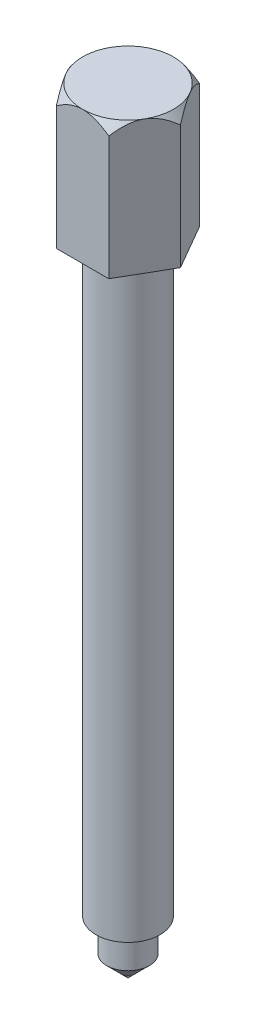
ISO-10303-21;
HEADER;
FILE_DESCRIPTION(('STEP AP214'),'2;1');
FILE_NAME('part.step','',(''),(''),'','','');
FILE_SCHEMA(('AUTOMOTIVE_DESIGN { 1 0 10303 214 1 1 1 1 }'));
ENDSEC;
DATA;
#1=APPLICATION_CONTEXT('core data for automotive mechanical design processes');
#2=APPLICATION_PROTOCOL_DEFINITION('international standard','automotive_design',2000,#1);
#3=PRODUCT_CONTEXT('',#1,'mechanical');
#4=PRODUCT('Part','Part','',(#3));
#5=PRODUCT_RELATED_PRODUCT_CATEGORY('part','',(#4));
#6=PRODUCT_DEFINITION_FORMATION('','',#4);
#7=PRODUCT_DEFINITION_CONTEXT('part definition',#1,'design');
#8=PRODUCT_DEFINITION('design','',#6,#7);
#9=PRODUCT_DEFINITION_SHAPE('','',#8);
#10=(LENGTH_UNIT() NAMED_UNIT(*) SI_UNIT(.MILLI.,.METRE.));
#11=(NAMED_UNIT(*) PLANE_ANGLE_UNIT() SI_UNIT($,.RADIAN.));
#12=(NAMED_UNIT(*) SI_UNIT($,.STERADIAN.) SOLID_ANGLE_UNIT());
#13=UNCERTAINTY_MEASURE_WITH_UNIT(LENGTH_MEASURE(1.E-05),#10,'distance_accuracy_value','');
#14=(GEOMETRIC_REPRESENTATION_CONTEXT(3) GLOBAL_UNCERTAINTY_ASSIGNED_CONTEXT((#13)) GLOBAL_UNIT_ASSIGNED_CONTEXT((#10,
#11,#12)) REPRESENTATION_CONTEXT('',''));
#15=CARTESIAN_POINT('',(0.,0.,0.));
#16=DIRECTION('',(0.,0.,1.));
#17=DIRECTION('',(1.,0.,0.));
#18=AXIS2_PLACEMENT_3D('',#15,#16,#17);
#19=CARTESIAN_POINT('',(0.,-135.,0.));
#20=DIRECTION('',(0.,-1.,0.));
#21=DIRECTION('',(0.,0.,-1.));
#22=AXIS2_PLACEMENT_3D('',#19,#20,#21);
#23=PLANE('',#22);
#24=CARTESIAN_POINT('',(0.,-135.,0.));
#25=DIRECTION('',(0.,-1.,0.));
#26=DIRECTION('',(0.,0.,-1.));
#27=AXIS2_PLACEMENT_3D('',#24,#25,#26);
#28=CIRCLE('',#27,6.);
#29=CARTESIAN_POINT('',(0.,-135.,-6.));
#30=VERTEX_POINT('',#29);
#31=EDGE_CURVE('E116',#30,#30,#28,.T.);
#32=ORIENTED_EDGE('',*,*,#31,.T.);
#33=EDGE_LOOP('',(#32));
#34=FACE_BOUND('',#33,.T.);
#35=CARTESIAN_POINT('',(0.,-135.,0.));
#36=DIRECTION('',(0.,-1.,0.));
#37=DIRECTION('',(0.,0.,-1.));
#38=AXIS2_PLACEMENT_3D('',#35,#36,#37);
#39=CIRCLE('',#38,4.);
#40=CARTESIAN_POINT('',(0.,-135.,-4.));
#41=VERTEX_POINT('',#40);
#42=EDGE_CURVE('E117',#41,#41,#39,.T.);
#43=ORIENTED_EDGE('',*,*,#42,.F.);
#44=EDGE_LOOP('',(#43));
#45=FACE_BOUND('',#44,.T.);
#46=ADVANCED_FACE('F33',(#34,#45),#23,.T.);
#47=CARTESIAN_POINT('',(0.,-25.,0.));
#48=DIRECTION('',(0.,1.,0.));
#49=DIRECTION('',(0.,0.,1.));
#50=AXIS2_PLACEMENT_3D('',#47,#48,#49);
#51=PLANE('',#50);
#52=DIRECTION('',(0.5,0.,-0.866025403784438));
#53=VECTOR('',#52,1.);
#54=CARTESIAN_POINT('',(4.90747728811183,-25.,8.49999999999999));
#55=LINE('',#54,#53);
#56=CARTESIAN_POINT('',(4.90747728811183,-25.,8.49999999999999));
#57=VERTEX_POINT('',#56);
#58=CARTESIAN_POINT('',(9.81495457622364,-25.,0.));
#59=VERTEX_POINT('',#58);
#60=EDGE_CURVE('E299',#57,#59,#55,.T.);
#61=ORIENTED_EDGE('',*,*,#60,.F.);
#62=DIRECTION('',(1.,0.,0.));
#63=VECTOR('',#62,1.);
#64=CARTESIAN_POINT('',(-4.90747728811181,-25.,8.49999999999999));
#65=LINE('',#64,#63);
#66=CARTESIAN_POINT('',(-4.90747728811181,-25.,8.49999999999999));
#67=VERTEX_POINT('',#66);
#68=EDGE_CURVE('E283',#67,#57,#65,.T.);
#69=ORIENTED_EDGE('',*,*,#68,.F.);
#70=DIRECTION('',(0.5,0.,0.866025403784438));
#71=VECTOR('',#70,1.);
#72=CARTESIAN_POINT('',(-9.81495457622364,-25.,0.));
#73=LINE('',#72,#71);
#74=CARTESIAN_POINT('',(-9.81495457622364,-25.,0.));
#75=VERTEX_POINT('',#74);
#76=EDGE_CURVE('E291',#75,#67,#73,.T.);
#77=ORIENTED_EDGE('',*,*,#76,.F.);
#78=DIRECTION('',(-0.5,0.,0.866025403784439));
#79=VECTOR('',#78,1.);
#80=CARTESIAN_POINT('',(-4.90747728811182,-25.,-8.5));
#81=LINE('',#80,#79);
#82=CARTESIAN_POINT('',(-4.90747728811182,-25.,-8.5));
#83=VERTEX_POINT('',#82);
#84=EDGE_CURVE('E293',#83,#75,#81,.T.);
#85=ORIENTED_EDGE('',*,*,#84,.F.);
#86=DIRECTION('',(-1.,0.,0.));
#87=VECTOR('',#86,1.);
#88=CARTESIAN_POINT('',(4.90747728811181,-25.,-8.5));
#89=LINE('',#88,#87);
#90=CARTESIAN_POINT('',(4.90747728811181,-25.,-8.5));
#91=VERTEX_POINT('',#90);
#92=EDGE_CURVE('E295',#91,#83,#89,.T.);
#93=ORIENTED_EDGE('',*,*,#92,.F.);
#94=DIRECTION('',(-0.5,0.,-0.866025403784439));
#95=VECTOR('',#94,1.);
#96=CARTESIAN_POINT('',(9.81495457622364,-25.,0.));
#97=LINE('',#96,#95);
#98=EDGE_CURVE('E298',#59,#91,#97,.T.);
#99=ORIENTED_EDGE('',*,*,#98,.F.);
#100=EDGE_LOOP('',(#61,#69,#77,#85,#93,#99));
#101=FACE_BOUND('',#100,.T.);
#102=CARTESIAN_POINT('',(0.,-25.,0.));
#103=DIRECTION('',(0.,1.,0.));
#104=DIRECTION('',(0.,0.,1.));
#105=AXIS2_PLACEMENT_3D('',#102,#103,#104);
#106=CIRCLE('',#105,6.);
#107=CARTESIAN_POINT('',(0.,-25.,6.));
#108=VERTEX_POINT('',#107);
#109=EDGE_CURVE('E12',#108,#108,#106,.F.);
#110=ORIENTED_EDGE('',*,*,#109,.F.);
#111=EDGE_LOOP('',(#110));
#112=FACE_BOUND('',#111,.T.);
#113=ADVANCED_FACE('F150',(#101,#112),#51,.F.);
#114=CARTESIAN_POINT('',(4.90747728811183,-25.,8.49999999999999));
#115=DIRECTION('',(0.866025403784438,0.,0.5));
#116=DIRECTION('',(0.5,0.,-0.866025403784439));
#117=AXIS2_PLACEMENT_3D('',#114,#115,#116);
#118=PLANE('',#117);
#119=DIRECTION('',(0.,1.,0.));
#120=VECTOR('',#119,1.);
#121=CARTESIAN_POINT('',(9.81495457622364,-25.,0.));
#122=LINE('',#121,#120);
#123=CARTESIAN_POINT('',(9.81495457622364,-1.87794975699021,0.));
#124=VERTEX_POINT('',#123);
#125=EDGE_CURVE('E281',#59,#124,#122,.T.);
#126=ORIENTED_EDGE('',*,*,#125,.T.);
#127=CARTESIAN_POINT('',(9.81507004627748,-1.87811466822755,-0.000199999999989855));
#128=CARTESIAN_POINT('',(9.76230056978781,-1.80275531241322,0.0911994143689311));
#129=CARTESIAN_POINT('',(9.7091035540061,-1.72859619090848,0.183339348513903));
#130=CARTESIAN_POINT('',(9.60177835257375,-1.58297351053905,0.369232050327299));
#131=CARTESIAN_POINT('',(9.54764995986844,-1.5115105626358,0.462985176624933));
#132=CARTESIAN_POINT('',(9.38343147938643,-1.30120059073214,0.747419928361531));
#133=CARTESIAN_POINT('',(9.27185316004035,-1.16693061463917,0.94067924649209));
#134=CARTESIAN_POINT('',(9.04194484200047,-0.91120264977615,1.33889213441986));
#135=CARTESIAN_POINT('',(8.92352191904883,-0.790076040303125,1.54400665375292));
#136=CARTESIAN_POINT('',(8.68202924347071,-0.568534504018789,1.96228423750998));
#137=CARTESIAN_POINT('',(8.5589660286768,-0.46809163700893,2.17543597807578));
#138=CARTESIAN_POINT('',(8.34813475248527,-0.320752758639446,2.5406064602641));
#139=CARTESIAN_POINT('',(8.26156723199829,-0.266981178647774,2.6905458040328));
#140=CARTESIAN_POINT('',(8.08657485916369,-0.173089367451726,2.99364148471936));
#141=CARTESIAN_POINT('',(7.99814996520608,-0.132969442426925,3.14679789370784));
#142=CARTESIAN_POINT('',(7.82076028808219,-0.0681984339921907,3.45404582722465));
#143=CARTESIAN_POINT('',(7.73180887541435,-0.0434022955975724,3.60811419337038));
#144=CARTESIAN_POINT('',(7.55315309463686,-0.0097070660004177,3.91755508274288));
#145=CARTESIAN_POINT('',(7.46344877794946,-0.000806897861248137,4.0729275169037));
#146=CARTESIAN_POINT('',(7.28376009602066,0.000703761962966103,4.38415744354946));
#147=CARTESIAN_POINT('',(7.19377563516265,-0.0067303114173442,4.54001510164724));
#148=CARTESIAN_POINT('',(7.01450128183219,-0.0376454291543157,4.85052739010966));
#149=CARTESIAN_POINT('',(6.92521143820876,-0.061127591958894,5.00518193586531));
#150=CARTESIAN_POINT('',(6.74709643314179,-0.123453569865872,5.31368617423168));
#151=CARTESIAN_POINT('',(6.65828432674416,-0.162445173754573,5.4675132548396));
#152=CARTESIAN_POINT('',(6.48249810048473,-0.254293061488693,5.77198392999173));
#153=CARTESIAN_POINT('',(6.39552393294219,-0.307148985180572,5.92262760712141));
#154=CARTESIAN_POINT('',(6.18228362148628,-0.453447545673494,6.29197066078487));
#155=CARTESIAN_POINT('',(6.05726620462303,-0.554177630267437,6.50850717862303));
#156=CARTESIAN_POINT('',(5.81199246146676,-0.777085871156933,6.9333337635323));
#157=CARTESIAN_POINT('',(5.69174329421759,-0.899294884870324,7.14161143077571));
#158=CARTESIAN_POINT('',(5.45835901496125,-1.15772358410916,7.54584486013553));
#159=CARTESIAN_POINT('',(5.34512808372239,-1.29360013280095,7.74196658602956));
#160=CARTESIAN_POINT('',(5.17853304809564,-1.50659100749409,8.03051765202385));
#161=CARTESIAN_POINT('',(5.12363573802908,-1.57898375856841,8.125602582258));
#162=CARTESIAN_POINT('',(5.01479992115449,-1.72654519885712,8.31411174676804));
#163=CARTESIAN_POINT('',(4.96086119077919,-1.80171322787202,8.40753636827382));
#164=CARTESIAN_POINT('',(4.90736181805799,-1.87811466822755,8.5002));
#165=B_SPLINE_CURVE_WITH_KNOTS('',3,(#127,#128,#129,#130,#131,#132,#133,#134,#135,#136,#137,
#138,#139,#140,#141,#142,#143,#144,#145,#146,#147,#148,#149,#150,#151,#152,#153,#154,#155,#156,
#157,#158,#159,#160,#161,#162,#163,#164),.UNSPECIFIED.,.F.,.F.,(4,2,2,2,2,2,2,2,2,2,2,2,2,2,2,2,
2,2,4),(0.,0.389030813280875,0.778149259073626,1.55893646007177,2.35625182429228,
3.15248298255888,3.69588824883662,4.2393057018147,4.77749704651659,5.31565192789133,
5.85527689161579,6.39493946754175,6.93987262339761,7.48479162492247,8.29213234295259,
9.10064254106636,9.89238476370198,10.2868888688589,10.6812997241885),.UNSPECIFIED.);
#166=CARTESIAN_POINT('',(7.36121593216773,0.,4.25));
#167=VERTEX_POINT('',#166);
#168=EDGE_CURVE('E57',#124,#167,#165,.T.);
#169=ORIENTED_EDGE('',*,*,#168,.T.);
#170=CARTESIAN_POINT('',(4.90747728811183,-1.87794975699021,8.49999999999999));
#171=VERTEX_POINT('',#170);
#172=EDGE_CURVE('E155',#167,#171,#165,.T.);
#173=ORIENTED_EDGE('',*,*,#172,.T.);
#174=DIRECTION('',(0.,1.,0.));
#175=VECTOR('',#174,1.);
#176=CARTESIAN_POINT('',(4.90747728811183,-25.,8.49999999999999));
#177=LINE('',#176,#175);
#178=EDGE_CURVE('E242',#57,#171,#177,.T.);
#179=ORIENTED_EDGE('',*,*,#178,.F.);
#180=ORIENTED_EDGE('',*,*,#60,.T.);
#181=EDGE_LOOP('',(#126,#169,#173,#179,#180));
#182=FACE_BOUND('',#181,.T.);
#183=ADVANCED_FACE('F35',(#182),#118,.T.);
#184=CARTESIAN_POINT('',(-4.90747728811181,-25.,8.49999999999999));
#185=DIRECTION('',(0.,0.,1.));
#186=DIRECTION('',(1.,0.,0.));
#187=AXIS2_PLACEMENT_3D('',#184,#185,#186);
#188=PLANE('',#187);
#189=ORIENTED_EDGE('',*,*,#178,.T.);
#190=CARTESIAN_POINT('',(-21.3095404127402,-20.6256605138428,8.49999999999999));
#191=CARTESIAN_POINT('',(-20.8437014007973,-20.0077832034049,8.49999999999999));
#192=CARTESIAN_POINT('',(-20.3765819130062,-19.3908656094274,8.49999999999999));
#193=CARTESIAN_POINT('',(-19.4390716135328,-18.1594697913909,8.49999999999999));
#194=CARTESIAN_POINT('',(-18.9686806276461,-17.5449917000129,8.49999999999999));
#195=CARTESIAN_POINT('',(-18.0226028783258,-16.3172913195609,8.49999999999999));
#196=CARTESIAN_POINT('',(-17.5469047452896,-15.7040777799293,8.49999999999999));
#197=CARTESIAN_POINT('',(-16.5905923635612,-14.4815246168883,8.49999999999999));
#198=CARTESIAN_POINT('',(-16.1099782683959,-13.8721848734571,8.49999999999999));
#199=CARTESIAN_POINT('',(-15.0918714858862,-12.5948923008473,8.49999999999999));
#200=CARTESIAN_POINT('',(-14.5536931981151,-11.9274839787999,8.49999999999999));
#201=CARTESIAN_POINT('',(-13.738819764298,-10.9325368173786,8.49999999999999));
#202=CARTESIAN_POINT('',(-13.4659113133435,-10.6018960150145,8.49999999999999));
#203=CARTESIAN_POINT('',(-12.9171354662544,-9.94308085835639,8.49999999999999));
#204=CARTESIAN_POINT('',(-12.6412680956621,-9.61490648281287,8.49999999999999));
#205=CARTESIAN_POINT('',(-12.0865074241747,-8.96203392414274,8.49999999999999));
#206=CARTESIAN_POINT('',(-11.8076197283163,-8.63733098375987,8.49999999999999));
#207=CARTESIAN_POINT('',(-11.2457440820257,-7.99149707377166,8.49999999999999));
#208=CARTESIAN_POINT('',(-10.9627562097306,-7.67036603630201,8.49999999999999));
#209=CARTESIAN_POINT('',(-10.3919177779791,-7.03255049112772,8.49999999999999));
#210=CARTESIAN_POINT('',(-10.1040680917915,-6.71586520321141,8.49999999999999));
#211=CARTESIAN_POINT('',(-9.52244239323267,-6.08799564236824,8.49999999999999));
#212=CARTESIAN_POINT('',(-9.22866669462067,-5.77681107982766,8.49999999999999));
#213=CARTESIAN_POINT('',(-8.7111521021791,-5.2414375245974,8.49999999999999));
#214=CARTESIAN_POINT('',(-8.48905737973764,-5.01566078908862,8.49999999999999));
#215=CARTESIAN_POINT('',(-8.04019225062514,-4.56877818308494,8.49999999999999));
#216=CARTESIAN_POINT('',(-7.81342171200322,-4.34767244476236,8.49999999999999));
#217=CARTESIAN_POINT('',(-7.35393828055348,-3.91079721960638,8.49999999999999));
#218=CARTESIAN_POINT('',(-7.12121466971991,-3.69503897028505,8.49999999999999));
#219=CARTESIAN_POINT('',(-6.64924612843774,-3.27077200517737,8.49999999999999));
#220=CARTESIAN_POINT('',(-6.41000156721989,-3.06226288044441,8.49999999999999));
#221=CARTESIAN_POINT('',(-5.92852421557355,-2.65846182794765,8.49999999999999));
#222=CARTESIAN_POINT('',(-5.68644246020903,-2.46299071720426,8.49999999999999));
#223=CARTESIAN_POINT('',(-5.19336295538314,-2.08339440878466,8.49999999999999));
#224=CARTESIAN_POINT('',(-4.94236266311904,-1.89927248851562,8.49999999999999));
#225=CARTESIAN_POINT('',(-4.43080521165388,-1.5465435929096,8.49999999999999));
#226=CARTESIAN_POINT('',(-4.17028164470958,-1.3778882908167,8.49999999999999));
#227=CARTESIAN_POINT('',(-3.63753919779129,-1.06035035971346,8.49999999999999));
#228=CARTESIAN_POINT('',(-3.36533051089788,-0.91145094332176,8.49999999999999));
#229=CARTESIAN_POINT('',(-2.90454170661202,-0.6868383876326,8.49999999999999));
#230=CARTESIAN_POINT('',(-2.71962133219954,-0.6036305749157,8.49999999999999));
#231=CARTESIAN_POINT('',(-2.3442442149385,-0.450587826240888,8.49999999999999));
#232=CARTESIAN_POINT('',(-2.15378691875131,-0.380754232178974,8.49999999999999));
#233=CARTESIAN_POINT('',(-1.76830552440799,-0.257013983915786,8.49999999999999));
#234=CARTESIAN_POINT('',(-1.57329586423727,-0.203062847182974,8.49999999999999));
#235=CARTESIAN_POINT('',(-1.17919286478832,-0.113111549556398,8.49999999999999));
#236=CARTESIAN_POINT('',(-0.980100896280727,-0.0771054625503315,8.49999999999999));
#237=CARTESIAN_POINT('',(-0.576761574656184,-0.0244927455968503,8.49999999999999));
#238=CARTESIAN_POINT('',(-0.372480862921843,-0.00813767008638935,8.49999999999999));
#239=CARTESIAN_POINT('',(0.0366725211385415,0.00340141702712675,8.49999999999999));
#240=CARTESIAN_POINT('',(0.241545153645023,-0.00141317892878567,8.49999999999999));
#241=CARTESIAN_POINT('',(0.6499631702871,-0.0319484131375409,8.49999999999999));
#242=CARTESIAN_POINT('',(0.853506559952684,-0.05769535000678,8.49999999999999));
#243=CARTESIAN_POINT('',(1.25714447975754,-0.128712043459351,8.49999999999999));
#244=CARTESIAN_POINT('',(1.45723825113328,-0.173986039564625,8.49999999999999));
#245=CARTESIAN_POINT('',(1.89025829628243,-0.292170995529551,8.49999999999999));
#246=CARTESIAN_POINT('',(2.12219059678525,-0.368700699659576,8.49999999999999));
#247=CARTESIAN_POINT('',(2.57820433537677,-0.54224188013021,8.49999999999999));
#248=CARTESIAN_POINT('',(2.80228312513127,-0.639260189541357,8.49999999999999));
#249=CARTESIAN_POINT('',(3.2432613457264,-0.85024903625238,8.49999999999999));
#250=CARTESIAN_POINT('',(3.46013109330196,-0.964281064116763,8.49999999999999));
#251=CARTESIAN_POINT('',(3.77966136475732,-1.14530508855897,8.49999999999999));
#252=CARTESIAN_POINT('',(3.88520163128472,-1.20730424394336,8.49999999999999));
#253=CARTESIAN_POINT('',(4.09446738904487,-1.33429416789766,8.49999999999999));
#254=CARTESIAN_POINT('',(4.19819290121824,-1.39928490191602,8.49999999999999));
#255=CARTESIAN_POINT('',(4.49663033895028,-1.59171490327232,8.49999999999999));
#256=CARTESIAN_POINT('',(4.68909391839894,-1.72264786000948,8.49999999999999));
#257=CARTESIAN_POINT('',(5.06846804361965,-1.99235907820973,8.49999999999999));
#258=CARTESIAN_POINT('',(5.25537726823708,-2.1311391837609,8.49999999999999));
#259=CARTESIAN_POINT('',(5.62439744594742,-2.41522230778645,8.49999999999999));
#260=CARTESIAN_POINT('',(5.80650436856746,-2.5605305449867,8.49999999999999));
#261=CARTESIAN_POINT('',(6.16636299879885,-2.85645902122694,8.49999999999999));
#262=CARTESIAN_POINT('',(6.34411429248374,-3.00707976183516,8.49999999999999));
#263=CARTESIAN_POINT('',(6.69635759337528,-3.31325111643676,8.49999999999999));
#264=CARTESIAN_POINT('',(6.8708366740767,-3.46881656668721,8.49999999999999));
#265=CARTESIAN_POINT('',(7.21638345822416,-3.78369700657644,8.49999999999999));
#266=CARTESIAN_POINT('',(7.3874510004996,-3.94301217259075,8.49999999999999));
#267=CARTESIAN_POINT('',(7.89598154816081,-4.42554405388388,8.49999999999999));
#268=CARTESIAN_POINT('',(8.22894849984498,-4.75350212411809,8.49999999999999));
#269=CARTESIAN_POINT('',(8.89066110560611,-5.42398810745172,8.49999999999999));
#270=CARTESIAN_POINT('',(9.21925467506416,-5.76666498927771,8.49999999999999));
#271=CARTESIAN_POINT('',(9.86870907412211,-6.45930890609325,8.49999999999999));
#272=CARTESIAN_POINT('',(10.1895691968796,-6.80927660205902,8.49999999999999));
#273=CARTESIAN_POINT('',(10.8243112810041,-7.51405121041901,8.49999999999999));
#274=CARTESIAN_POINT('',(11.1382072436383,-7.86884554993427,8.49999999999999));
#275=CARTESIAN_POINT('',(11.7608797317737,-8.58286325387977,8.49999999999999));
#276=CARTESIAN_POINT('',(12.0696564778654,-8.94208642629951,8.49999999999999));
#277=CARTESIAN_POINT('',(12.6769365270529,-9.65700197424495,8.49999999999999));
#278=CARTESIAN_POINT('',(12.9755223586282,-10.0126243544446,8.49999999999999));
#279=CARTESIAN_POINT('',(13.5692772073744,-10.7267122015985,8.49999999999999));
#280=CARTESIAN_POINT('',(13.8644461916871,-11.0851776958377,8.49999999999999));
#281=CARTESIAN_POINT('',(14.7456561315037,-12.1641341030516,8.49999999999999));
#282=CARTESIAN_POINT('',(15.3273748483964,-12.8881550450251,8.49999999999999));
#283=CARTESIAN_POINT('',(16.4824297702023,-14.3430395271192,8.49999999999999));
#284=CARTESIAN_POINT('',(17.0557644547369,-15.0739042698399,8.49999999999999));
#285=CARTESIAN_POINT('',(18.1959802005468,-16.540656604237,8.49999999999999));
#286=CARTESIAN_POINT('',(18.7628611981995,-17.2765442453166,8.49999999999999));
#287=CARTESIAN_POINT('',(19.8925143899457,-18.7533499230954,8.49999999999999));
#288=CARTESIAN_POINT('',(20.4552784506936,-19.4942741730339,8.49999999999999));
#289=CARTESIAN_POINT('',(21.5768129037927,-20.9791427324631,8.49999999999999));
#290=CARTESIAN_POINT('',(22.1355832756458,-21.7230870574241,8.49999999999999));
#291=CARTESIAN_POINT('',(23.2498395866242,-23.2133009433884,8.49999999999999));
#292=CARTESIAN_POINT('',(23.8053258837309,-23.9595702368927,8.49999999999999));
#293=CARTESIAN_POINT('',(24.9136586453147,-25.4540664607185,8.49999999999999));
#294=CARTESIAN_POINT('',(25.4665051075771,-26.2022933926816,8.49999999999999));
#295=CARTESIAN_POINT('',(27.0129610909379,-28.3016533417894,8.49999999999999));
#296=CARTESIAN_POINT('',(28.0041223927444,-29.6545896223254,8.49999999999999));
#297=CARTESIAN_POINT('',(29.9813110092209,-32.3642722017759,8.49999999999999));
#298=CARTESIAN_POINT('',(30.9673381535921,-33.721018624803,8.49999999999999));
#299=CARTESIAN_POINT('',(32.9332100335643,-36.4342083214659,8.49999999999999));
#300=CARTESIAN_POINT('',(33.9130637868777,-37.7906450633785,8.49999999999999));
#301=CARTESIAN_POINT('',(35.3805625988303,-39.8269031436483,8.49999999999999));
#302=CARTESIAN_POINT('',(35.869339027296,-40.5059096998253,8.49999999999999));
#303=CARTESIAN_POINT('',(36.8462181461158,-41.864406832238,8.49999999999999));
#304=CARTESIAN_POINT('',(37.334320836782,-42.5438974082494,8.49999999999999));
#305=CARTESIAN_POINT('',(37.82212709977,-43.2236007530345,8.49999999999999));
#306=B_SPLINE_CURVE_WITH_KNOTS('',3,(#190,#191,#192,#193,#194,#195,#196,#197,#198,#199,#200,
#201,#202,#203,#204,#205,#206,#207,#208,#209,#210,#211,#212,#213,#214,#215,#216,#217,#218,#219,
#220,#221,#222,#223,#224,#225,#226,#227,#228,#229,#230,#231,#232,#233,#234,#235,#236,#237,#238,
#239,#240,#241,#242,#243,#244,#245,#246,#247,#248,#249,#250,#251,#252,#253,#254,#255,#256,#257,
#258,#259,#260,#261,#262,#263,#264,#265,#266,#267,#268,#269,#270,#271,#272,#273,#274,#275,#276,
#277,#278,#279,#280,#281,#282,#283,#284,#285,#286,#287,#288,#289,#290,#291,#292,#293,#294,#295,
#296,#297,#298,#299,#300,#301,#302,#303,#304,#305),.UNSPECIFIED.,.F.,.F.,(4,2,2,2,2,2,2,2,2,2,2,
2,2,2,2,2,2,2,2,2,2,2,2,2,2,2,2,2,2,2,2,2,2,2,2,2,2,2,2,2,2,2,2,2,2,2,2,2,2,2,2,2,2,2,2,2,2,4),
(0.,2.32142809707147,4.64298076938176,6.97123692799416,9.29942059520069,11.8714211093192,
13.157572954941,14.4437137069754,15.7277777898098,17.0118174342672,18.2956288444844,
19.5793724593644,20.529428050193,21.47951048825,22.431444217803,23.3833241582613,
24.3165043712921,25.2499528166453,26.1803774643692,27.110006358483,27.7179171639046,
28.3258889318554,28.932141369517,29.5381934675531,30.1519237473412,30.7656136594533,
31.3800757824696,31.9946713786303,32.7261646893776,33.457902343809,34.1923517323288,
34.5595232628398,34.9266905537285,35.6247621698041,36.3229985207896,37.0218033503636,
37.7206743335861,38.4218885887278,39.1231358930885,40.524927427755,41.9490820038991,
43.3733662588941,44.7944652229736,46.2155027909621,47.6085270511647,49.001564696228,
51.7877573190044,54.5744490821943,57.3611682937703,60.1523970030658,62.9436400283251,
65.7345729658278,68.5255082442209,73.5569437884903,78.5885451744789,83.6085300889079,
86.1184243503786,88.6283174492745),.UNSPECIFIED.);
#307=CARTESIAN_POINT('',(0.,0.,8.5));
#308=VERTEX_POINT('',#307);
#309=EDGE_CURVE('E246',#171,#308,#306,.F.);
#310=ORIENTED_EDGE('',*,*,#309,.T.);
#311=CARTESIAN_POINT('',(-4.90747728811181,-1.8779497569902,8.49999999999999));
#312=VERTEX_POINT('',#311);
#313=EDGE_CURVE('E178',#308,#312,#306,.F.);
#314=ORIENTED_EDGE('',*,*,#313,.T.);
#315=DIRECTION('',(0.,1.,0.));
#316=VECTOR('',#315,1.);
#317=CARTESIAN_POINT('',(-4.90747728811181,-25.,8.49999999999999));
#318=LINE('',#317,#316);
#319=EDGE_CURVE('E252',#67,#312,#318,.T.);
#320=ORIENTED_EDGE('',*,*,#319,.F.);
#321=ORIENTED_EDGE('',*,*,#68,.T.);
#322=EDGE_LOOP('',(#189,#310,#314,#320,#321));
#323=FACE_BOUND('',#322,.T.);
#324=ADVANCED_FACE('F187',(#323),#188,.T.);
#325=CARTESIAN_POINT('',(-9.81495457622364,-25.,0.));
#326=DIRECTION('',(-0.866025403784438,0.,0.5));
#327=DIRECTION('',(0.5,0.,0.866025403784439));
#328=AXIS2_PLACEMENT_3D('',#325,#326,#327);
#329=PLANE('',#328);
#330=ORIENTED_EDGE('',*,*,#319,.T.);
#331=CARTESIAN_POINT('',(-4.90736181805798,-1.87811466822754,8.5002));
#332=CARTESIAN_POINT('',(-4.96013129454765,-1.8027553124132,8.40880058563108));
#333=CARTESIAN_POINT('',(-5.01332831032936,-1.72859619090846,8.3166606514861));
#334=CARTESIAN_POINT('',(-5.12065351176171,-1.58297351053903,8.13076794967271));
#335=CARTESIAN_POINT('',(-5.17478190446702,-1.51151056263578,8.03701482337508));
#336=CARTESIAN_POINT('',(-5.33900038494903,-1.30120059073212,7.75258007163848));
#337=CARTESIAN_POINT('',(-5.45057870429511,-1.16693061463915,7.55932075350792));
#338=CARTESIAN_POINT('',(-5.68048702233499,-0.911202649776133,7.16110786558015));
#339=CARTESIAN_POINT('',(-5.79890994528663,-0.79007604030311,6.95599334624709));
#340=CARTESIAN_POINT('',(-6.04040262086475,-0.568534504018774,6.53771576249004));
#341=CARTESIAN_POINT('',(-6.16346583565865,-0.468091637008913,6.32456402192424));
#342=CARTESIAN_POINT('',(-6.37429711185019,-0.320752758639429,5.95939353973591));
#343=CARTESIAN_POINT('',(-6.46086463233716,-0.266981178647758,5.80945419596721));
#344=CARTESIAN_POINT('',(-6.63585700517176,-0.173089367451709,5.50635851528065));
#345=CARTESIAN_POINT('',(-6.72428189912937,-0.132969442426907,5.35320210629217));
#346=CARTESIAN_POINT('',(-6.90167157625326,-0.0681984339921731,5.04595417277536));
#347=CARTESIAN_POINT('',(-6.9906229889211,-0.043402295597556,4.89188580662963));
#348=CARTESIAN_POINT('',(-7.16927876969859,-0.00970706600040048,4.58244491725713));
#349=CARTESIAN_POINT('',(-7.25898308638599,-0.000806897861228869,4.42707248309631));
#350=CARTESIAN_POINT('',(-7.43867176831479,0.000703761962986469,4.11584255645055));
#351=CARTESIAN_POINT('',(-7.52865622917281,-0.0067303114173248,3.95998489835277));
#352=CARTESIAN_POINT('',(-7.70793058250327,-0.037645429154296,3.64947260989036));
#353=CARTESIAN_POINT('',(-7.79722042612669,-0.0611275919588731,3.4948180641347));
#354=CARTESIAN_POINT('',(-7.97533543119366,-0.12345356986585,3.18631382576834));
#355=CARTESIAN_POINT('',(-8.06414753759129,-0.162445173754551,3.03248674516042));
#356=CARTESIAN_POINT('',(-8.23993376385072,-0.25429306148867,2.72801607000829));
#357=CARTESIAN_POINT('',(-8.32690793139326,-0.30714898518055,2.57737239287861));
#358=CARTESIAN_POINT('',(-8.54014824284918,-0.453447545673471,2.20802933921515));
#359=CARTESIAN_POINT('',(-8.66516565971242,-0.554177630267415,1.99149282137699));
#360=CARTESIAN_POINT('',(-8.9104394028687,-0.777085871156912,1.56666623646771));
#361=CARTESIAN_POINT('',(-9.03068857011787,-0.899294884870303,1.3583885692243));
#362=CARTESIAN_POINT('',(-9.26407284937421,-1.15772358410915,0.954155139864475));
#363=CARTESIAN_POINT('',(-9.37730378061307,-1.29360013280093,0.758033413970443));
#364=CARTESIAN_POINT('',(-9.54389881623983,-1.50659100749409,0.469482347976149));
#365=CARTESIAN_POINT('',(-9.59879612630639,-1.5789837585684,0.374397417742002));
#366=CARTESIAN_POINT('',(-9.70763194318097,-1.72654519885711,0.185888253231959));
#367=CARTESIAN_POINT('',(-9.76157067355628,-1.80171322787202,0.0924636317261756));
#368=CARTESIAN_POINT('',(-9.81507004627747,-1.87811466822754,-0.000200000000002088));
#369=B_SPLINE_CURVE_WITH_KNOTS('',3,(#331,#332,#333,#334,#335,#336,#337,#338,#339,#340,#341,
#342,#343,#344,#345,#346,#347,#348,#349,#350,#351,#352,#353,#354,#355,#356,#357,#358,#359,#360,
#361,#362,#363,#364,#365,#366,#367,#368),.UNSPECIFIED.,.F.,.F.,(4,2,2,2,2,2,2,2,2,2,2,2,2,2,2,2,
2,2,4),(0.,0.389030813280875,0.778149259073625,1.55893646007176,2.35625182429228,
3.15248298255887,3.69588824883662,4.2393057018147,4.77749704651658,5.31565192789132,
5.85527689161578,6.39493946754174,6.9398726233976,7.48479162492246,8.29213234295259,
9.10064254106636,9.89238476370199,10.2868888688589,10.6812997241886),.UNSPECIFIED.);
#370=CARTESIAN_POINT('',(-7.36121593216773,0.,4.25));
#371=VERTEX_POINT('',#370);
#372=EDGE_CURVE('E176',#312,#371,#369,.T.);
#373=ORIENTED_EDGE('',*,*,#372,.T.);
#374=CARTESIAN_POINT('',(-9.81495457622364,-1.8779497569902,0.));
#375=VERTEX_POINT('',#374);
#376=EDGE_CURVE('E170',#371,#375,#369,.T.);
#377=ORIENTED_EDGE('',*,*,#376,.T.);
#378=DIRECTION('',(0.,1.,0.));
#379=VECTOR('',#378,1.);
#380=CARTESIAN_POINT('',(-9.81495457622364,-25.,0.));
#381=LINE('',#380,#379);
#382=EDGE_CURVE('E272',#75,#375,#381,.T.);
#383=ORIENTED_EDGE('',*,*,#382,.F.);
#384=ORIENTED_EDGE('',*,*,#76,.T.);
#385=EDGE_LOOP('',(#330,#373,#377,#383,#384));
#386=FACE_BOUND('',#385,.T.);
#387=ADVANCED_FACE('F183',(#386),#329,.T.);
#388=CARTESIAN_POINT('',(-4.90747728811182,-25.,-8.5));
#389=DIRECTION('',(-0.866025403784439,0.,-0.5));
#390=DIRECTION('',(-0.5,0.,0.866025403784439));
#391=AXIS2_PLACEMENT_3D('',#388,#389,#390);
#392=PLANE('',#391);
#393=ORIENTED_EDGE('',*,*,#382,.T.);
#394=CARTESIAN_POINT('',(-9.81507004627747,-1.87811466822754,0.00019999999999829));
#395=CARTESIAN_POINT('',(-9.7623005697878,-1.8027553124132,-0.0911994143689234));
#396=CARTESIAN_POINT('',(-9.70910355400609,-1.72859619090846,-0.183339348513895));
#397=CARTESIAN_POINT('',(-9.60177835257374,-1.58297351053904,-0.369232050327291));
#398=CARTESIAN_POINT('',(-9.54764995986843,-1.51151056263579,-0.462985176624924));
#399=CARTESIAN_POINT('',(-9.38343147938642,-1.30120059073213,-0.747419928361521));
#400=CARTESIAN_POINT('',(-9.27185316004034,-1.16693061463915,-0.94067924649208));
#401=CARTESIAN_POINT('',(-9.04194484200046,-0.911202649776138,-1.33889213441985));
#402=CARTESIAN_POINT('',(-8.92352191904882,-0.790076040303113,-1.54400665375291));
#403=CARTESIAN_POINT('',(-8.6820292434707,-0.568534504018778,-1.96228423750996));
#404=CARTESIAN_POINT('',(-8.5589660286768,-0.468091637008919,-2.17543597807576));
#405=CARTESIAN_POINT('',(-8.34813475248526,-0.320752758639434,-2.54060646026409));
#406=CARTESIAN_POINT('',(-8.26156723199829,-0.266981178647761,-2.69054580403279));
#407=CARTESIAN_POINT('',(-8.08657485916369,-0.173089367451713,-2.99364148471935));
#408=CARTESIAN_POINT('',(-7.99814996520607,-0.132969442426911,-3.14679789370783));
#409=CARTESIAN_POINT('',(-7.82076028808219,-0.0681984339921783,-3.45404582722464));
#410=CARTESIAN_POINT('',(-7.73180887541434,-0.0434022955975608,-3.60811419337037));
#411=CARTESIAN_POINT('',(-7.55315309463685,-0.00970706600040438,-3.91755508274287));
#412=CARTESIAN_POINT('',(-7.46344877794946,-0.000806897861232293,-4.07292751690369));
#413=CARTESIAN_POINT('',(-7.28376009602066,0.000703761962982454,-4.38415744354945));
#414=CARTESIAN_POINT('',(-7.19377563516264,-0.00673031141732985,-4.54001510164723));
#415=CARTESIAN_POINT('',(-7.01450128183218,-0.0376454291543015,-4.85052739010964));
#416=CARTESIAN_POINT('',(-6.92521143820875,-0.061127591958878,-5.0051819358653));
#417=CARTESIAN_POINT('',(-6.74709643314179,-0.123453569865854,-5.31368617423167));
#418=CARTESIAN_POINT('',(-6.65828432674415,-0.162445173754555,-5.46751325483959));
#419=CARTESIAN_POINT('',(-6.48249810048473,-0.254293061488675,-5.77198392999172));
#420=CARTESIAN_POINT('',(-6.39552393294219,-0.307148985180555,-5.9226276071214));
#421=CARTESIAN_POINT('',(-6.18228362148627,-0.453447545673477,-6.29197066078485));
#422=CARTESIAN_POINT('',(-6.05726620462303,-0.554177630267421,-6.50850717862302));
#423=CARTESIAN_POINT('',(-5.81199246146675,-0.777085871156918,-6.93333376353229));
#424=CARTESIAN_POINT('',(-5.69174329421758,-0.89929488487031,-7.1416114307757));
#425=CARTESIAN_POINT('',(-5.45835901496124,-1.15772358410915,-7.54584486013553));
#426=CARTESIAN_POINT('',(-5.34512808372238,-1.29360013280094,-7.74196658602956));
#427=CARTESIAN_POINT('',(-5.17853304809562,-1.50659100749409,-8.03051765202385));
#428=CARTESIAN_POINT('',(-5.12363573802906,-1.5789837585684,-8.125602582258));
#429=CARTESIAN_POINT('',(-5.01479992115448,-1.72654519885711,-8.31411174676804));
#430=CARTESIAN_POINT('',(-4.96086119077917,-1.80171322787202,-8.40753636827383));
#431=CARTESIAN_POINT('',(-4.90736181805798,-1.87811466822755,-8.5002));
#432=B_SPLINE_CURVE_WITH_KNOTS('',3,(#394,#395,#396,#397,#398,#399,#400,#401,#402,#403,#404,
#405,#406,#407,#408,#409,#410,#411,#412,#413,#414,#415,#416,#417,#418,#419,#420,#421,#422,#423,
#424,#425,#426,#427,#428,#429,#430,#431),.UNSPECIFIED.,.F.,.F.,(4,2,2,2,2,2,2,2,2,2,2,2,2,2,2,2,
2,2,4),(0.,0.389030813280876,0.778149259073627,1.55893646007176,2.35625182429228,
3.15248298255888,3.69588824883662,4.2393057018147,4.77749704651658,5.31565192789132,
5.85527689161578,6.39493946754174,6.93987262339761,7.48479162492247,8.29213234295259,
9.10064254106637,9.892384763702,10.2868888688589,10.6812997241886),.UNSPECIFIED.);
#433=CARTESIAN_POINT('',(-7.36121593216773,0.,-4.25));
#434=VERTEX_POINT('',#433);
#435=EDGE_CURVE('E177',#375,#434,#432,.T.);
#436=ORIENTED_EDGE('',*,*,#435,.T.);
#437=CARTESIAN_POINT('',(-4.90747728811182,-1.87794975699021,-8.5));
#438=VERTEX_POINT('',#437);
#439=EDGE_CURVE('E164',#434,#438,#432,.T.);
#440=ORIENTED_EDGE('',*,*,#439,.T.);
#441=DIRECTION('',(0.,1.,0.));
#442=VECTOR('',#441,1.);
#443=CARTESIAN_POINT('',(-4.90747728811182,-25.,-8.5));
#444=LINE('',#443,#442);
#445=EDGE_CURVE('E285',#83,#438,#444,.T.);
#446=ORIENTED_EDGE('',*,*,#445,.F.);
#447=ORIENTED_EDGE('',*,*,#84,.T.);
#448=EDGE_LOOP('',(#393,#436,#440,#446,#447));
#449=FACE_BOUND('',#448,.T.);
#450=ADVANCED_FACE('F186',(#449),#392,.T.);
#451=CARTESIAN_POINT('',(4.90747728811181,-25.,-8.5));
#452=DIRECTION('',(0.,0.,-1.));
#453=DIRECTION('',(-1.,0.,0.));
#454=AXIS2_PLACEMENT_3D('',#451,#452,#453);
#455=PLANE('',#454);
#456=ORIENTED_EDGE('',*,*,#445,.T.);
#457=CARTESIAN_POINT('',(-21.3095404127403,-20.6256605138428,-8.5));
#458=CARTESIAN_POINT('',(-20.8437014007973,-20.007783203405,-8.5));
#459=CARTESIAN_POINT('',(-20.3765819130062,-19.3908656094274,-8.5));
#460=CARTESIAN_POINT('',(-19.4390716135328,-18.1594697913909,-8.5));
#461=CARTESIAN_POINT('',(-18.9686806276461,-17.5449917000129,-8.5));
#462=CARTESIAN_POINT('',(-18.0226028783258,-16.3172913195609,-8.5));
#463=CARTESIAN_POINT('',(-17.5469047452896,-15.7040777799293,-8.5));
#464=CARTESIAN_POINT('',(-16.5905923635613,-14.4815246168883,-8.5));
#465=CARTESIAN_POINT('',(-16.1099782683959,-13.8721848734571,-8.5));
#466=CARTESIAN_POINT('',(-15.0918714858862,-12.5948923008473,-8.5));
#467=CARTESIAN_POINT('',(-14.5536931981151,-11.9274839787999,-8.5));
#468=CARTESIAN_POINT('',(-13.738819764298,-10.9325368173786,-8.5));
#469=CARTESIAN_POINT('',(-13.4659113133435,-10.6018960150145,-8.5));
#470=CARTESIAN_POINT('',(-12.9171354662544,-9.94308085835641,-8.5));
#471=CARTESIAN_POINT('',(-12.6412680956622,-9.61490648281289,-8.5));
#472=CARTESIAN_POINT('',(-12.0865074241747,-8.96203392414276,-8.5));
#473=CARTESIAN_POINT('',(-11.8076197283164,-8.63733098375989,-8.5));
#474=CARTESIAN_POINT('',(-11.2457440820257,-7.99149707377169,-8.5));
#475=CARTESIAN_POINT('',(-10.9627562097306,-7.67036603630203,-8.5));
#476=CARTESIAN_POINT('',(-10.3919177779791,-7.03255049112774,-8.5));
#477=CARTESIAN_POINT('',(-10.1040680917916,-6.71586520321144,-8.5));
#478=CARTESIAN_POINT('',(-9.52244239323269,-6.08799564236827,-8.5));
#479=CARTESIAN_POINT('',(-9.22866669462069,-5.77681107982768,-8.5));
#480=CARTESIAN_POINT('',(-8.71115210217911,-5.24143752459742,-8.5));
#481=CARTESIAN_POINT('',(-8.48905737973766,-5.01566078908865,-8.5));
#482=CARTESIAN_POINT('',(-8.04019225062516,-4.56877818308496,-8.5));
#483=CARTESIAN_POINT('',(-7.81342171200324,-4.34767244476239,-8.5));
#484=CARTESIAN_POINT('',(-7.3539382805535,-3.9107972196064,-8.5));
#485=CARTESIAN_POINT('',(-7.12121466971992,-3.69503897028507,-8.5));
#486=CARTESIAN_POINT('',(-6.64924612843775,-3.27077200517738,-8.5));
#487=CARTESIAN_POINT('',(-6.41000156721991,-3.06226288044442,-8.5));
#488=CARTESIAN_POINT('',(-5.92852421557356,-2.65846182794766,-8.5));
#489=CARTESIAN_POINT('',(-5.68644246020904,-2.46299071720427,-8.5));
#490=CARTESIAN_POINT('',(-5.19336295538315,-2.08339440878467,-8.5));
#491=CARTESIAN_POINT('',(-4.94236266311904,-1.89927248851563,-8.5));
#492=CARTESIAN_POINT('',(-4.43080521165388,-1.54654359290961,-8.5));
#493=CARTESIAN_POINT('',(-4.17028164470958,-1.37788829081671,-8.5));
#494=CARTESIAN_POINT('',(-3.63753919779129,-1.06035035971347,-8.5));
#495=CARTESIAN_POINT('',(-3.36533051089788,-0.911450943321769,-8.5));
#496=CARTESIAN_POINT('',(-2.90454170661202,-0.68683838763261,-8.5));
#497=CARTESIAN_POINT('',(-2.71962133219954,-0.60363057491571,-8.5));
#498=CARTESIAN_POINT('',(-2.3442442149385,-0.450587826240897,-8.5));
#499=CARTESIAN_POINT('',(-2.15378691875132,-0.380754232178982,-8.5));
#500=CARTESIAN_POINT('',(-1.76830552440799,-0.257013983915794,-8.5));
#501=CARTESIAN_POINT('',(-1.57329586423727,-0.203062847182983,-8.5));
#502=CARTESIAN_POINT('',(-1.17919286478832,-0.113111549556407,-8.5));
#503=CARTESIAN_POINT('',(-0.980100896280728,-0.0771054625503389,-8.5));
#504=CARTESIAN_POINT('',(-0.576761574656185,-0.0244927455968577,-8.5));
#505=CARTESIAN_POINT('',(-0.372480862921842,-0.0081376700863991,-8.5));
#506=CARTESIAN_POINT('',(0.036672521138542,0.00340141702711662,-8.5));
#507=CARTESIAN_POINT('',(0.241545153645022,-0.00141317892879357,-8.5));
#508=CARTESIAN_POINT('',(0.649963170287099,-0.031948413137548,-8.5));
#509=CARTESIAN_POINT('',(0.853506559952684,-0.057695350006789,-8.5));
#510=CARTESIAN_POINT('',(1.25714447975754,-0.128712043459361,-8.5));
#511=CARTESIAN_POINT('',(1.45723825113328,-0.173986039564635,-8.5));
#512=CARTESIAN_POINT('',(1.89025829628243,-0.29217099552956,-8.5));
#513=CARTESIAN_POINT('',(2.12219059678526,-0.368700699659585,-8.5));
#514=CARTESIAN_POINT('',(2.57820433537678,-0.54224188013022,-8.5));
#515=CARTESIAN_POINT('',(2.80228312513127,-0.639260189541367,-8.5));
#516=CARTESIAN_POINT('',(3.2432613457264,-0.850249036252389,-8.5));
#517=CARTESIAN_POINT('',(3.46013109330196,-0.96428106411677,-8.5));
#518=CARTESIAN_POINT('',(3.77966136475733,-1.14530508855898,-8.5));
#519=CARTESIAN_POINT('',(3.88520163128472,-1.20730424394337,-8.5));
#520=CARTESIAN_POINT('',(4.09446738904487,-1.33429416789767,-8.5));
#521=CARTESIAN_POINT('',(4.19819290121824,-1.39928490191603,-8.5));
#522=CARTESIAN_POINT('',(4.49663033895028,-1.59171490327233,-8.5));
#523=CARTESIAN_POINT('',(4.68909391839894,-1.72264786000948,-8.5));
#524=CARTESIAN_POINT('',(5.06846804361965,-1.99235907820974,-8.5));
#525=CARTESIAN_POINT('',(5.25537726823708,-2.13113918376091,-8.5));
#526=CARTESIAN_POINT('',(5.62439744594742,-2.41522230778646,-8.5));
#527=CARTESIAN_POINT('',(5.80650436856746,-2.5605305449867,-8.5));
#528=CARTESIAN_POINT('',(6.16636299879885,-2.85645902122695,-8.5));
#529=CARTESIAN_POINT('',(6.34411429248374,-3.00707976183517,-8.5));
#530=CARTESIAN_POINT('',(6.69635759337528,-3.31325111643677,-8.5));
#531=CARTESIAN_POINT('',(6.87083667407669,-3.46881656668721,-8.5));
#532=CARTESIAN_POINT('',(7.21638345822416,-3.78369700657645,-8.5));
#533=CARTESIAN_POINT('',(7.38745100049959,-3.94301217259076,-8.5));
#534=CARTESIAN_POINT('',(7.89598154816081,-4.42554405388389,-8.5));
#535=CARTESIAN_POINT('',(8.22894849984498,-4.7535021241181,-8.5));
#536=CARTESIAN_POINT('',(8.89066110560611,-5.42398810745173,-8.5));
#537=CARTESIAN_POINT('',(9.21925467506417,-5.76666498927772,-8.5));
#538=CARTESIAN_POINT('',(9.86870907412212,-6.45930890609327,-8.5));
#539=CARTESIAN_POINT('',(10.1895691968796,-6.80927660205903,-8.5));
#540=CARTESIAN_POINT('',(10.8243112810041,-7.51405121041902,-8.5));
#541=CARTESIAN_POINT('',(11.1382072436383,-7.86884554993429,-8.5));
#542=CARTESIAN_POINT('',(11.7608797317737,-8.58286325387979,-8.5));
#543=CARTESIAN_POINT('',(12.0696564778654,-8.94208642629952,-8.5));
#544=CARTESIAN_POINT('',(12.6769365270529,-9.65700197424496,-8.5));
#545=CARTESIAN_POINT('',(12.9755223586282,-10.0126243544446,-8.5));
#546=CARTESIAN_POINT('',(13.5692772073744,-10.7267122015985,-8.5));
#547=CARTESIAN_POINT('',(13.8644461916872,-11.0851776958377,-8.5));
#548=CARTESIAN_POINT('',(14.7456561315037,-12.1641341030516,-8.5));
#549=CARTESIAN_POINT('',(15.3273748483964,-12.8881550450251,-8.5));
#550=CARTESIAN_POINT('',(16.4824297702024,-14.3430395271192,-8.5));
#551=CARTESIAN_POINT('',(17.0557644547369,-15.0739042698399,-8.5));
#552=CARTESIAN_POINT('',(18.1959802005468,-16.540656604237,-8.5));
#553=CARTESIAN_POINT('',(18.7628611981995,-17.2765442453166,-8.5));
#554=CARTESIAN_POINT('',(19.8925143899457,-18.7533499230954,-8.5));
#555=CARTESIAN_POINT('',(20.4552784506936,-19.4942741730339,-8.5));
#556=CARTESIAN_POINT('',(21.5768129037927,-20.9791427324631,-8.5));
#557=CARTESIAN_POINT('',(22.1355832756458,-21.7230870574241,-8.5));
#558=CARTESIAN_POINT('',(23.2498395866242,-23.2133009433884,-8.5));
#559=CARTESIAN_POINT('',(23.8053258837309,-23.9595702368927,-8.5));
#560=CARTESIAN_POINT('',(24.9136586453147,-25.4540664607185,-8.5));
#561=CARTESIAN_POINT('',(25.4665051075771,-26.2022933926816,-8.5));
#562=CARTESIAN_POINT('',(27.0129610909379,-28.3016533417894,-8.5));
#563=CARTESIAN_POINT('',(28.0041223927444,-29.6545896223254,-8.5));
#564=CARTESIAN_POINT('',(29.9813110092209,-32.3642722017759,-8.5));
#565=CARTESIAN_POINT('',(30.9673381535921,-33.721018624803,-8.5));
#566=CARTESIAN_POINT('',(32.9332100335643,-36.434208321466,-8.5));
#567=CARTESIAN_POINT('',(33.9130637868777,-37.7906450633786,-8.5));
#568=CARTESIAN_POINT('',(35.3805625988303,-39.8269031436483,-8.5));
#569=CARTESIAN_POINT('',(35.869339027296,-40.5059096998253,-8.5));
#570=CARTESIAN_POINT('',(36.8462181461158,-41.864406832238,-8.5));
#571=CARTESIAN_POINT('',(37.334320836782,-42.5438974082494,-8.5));
#572=CARTESIAN_POINT('',(37.82212709977,-43.2236007530345,-8.5));
#573=B_SPLINE_CURVE_WITH_KNOTS('',3,(#457,#458,#459,#460,#461,#462,#463,#464,#465,#466,#467,
#468,#469,#470,#471,#472,#473,#474,#475,#476,#477,#478,#479,#480,#481,#482,#483,#484,#485,#486,
#487,#488,#489,#490,#491,#492,#493,#494,#495,#496,#497,#498,#499,#500,#501,#502,#503,#504,#505,
#506,#507,#508,#509,#510,#511,#512,#513,#514,#515,#516,#517,#518,#519,#520,#521,#522,#523,#524,
#525,#526,#527,#528,#529,#530,#531,#532,#533,#534,#535,#536,#537,#538,#539,#540,#541,#542,#543,
#544,#545,#546,#547,#548,#549,#550,#551,#552,#553,#554,#555,#556,#557,#558,#559,#560,#561,#562,
#563,#564,#565,#566,#567,#568,#569,#570,#571,#572),.UNSPECIFIED.,.F.,.F.,(4,2,2,2,2,2,2,2,2,2,2,
2,2,2,2,2,2,2,2,2,2,2,2,2,2,2,2,2,2,2,2,2,2,2,2,2,2,2,2,2,2,2,2,2,2,2,2,2,2,2,2,2,2,2,2,2,2,4),
(0.,2.32142809707146,4.64298076938176,6.97123692799416,9.2994205952007,11.8714211093192,
13.157572954941,14.4437137069754,15.7277777898098,17.0118174342672,18.2956288444844,
19.5793724593644,20.529428050193,21.47951048825,22.431444217803,23.3833241582613,
24.3165043712921,25.2499528166453,26.1803774643692,27.110006358483,27.7179171639046,
28.3258889318554,28.932141369517,29.5381934675531,30.1519237473412,30.7656136594533,
31.3800757824697,31.9946713786304,32.7261646893777,33.457902343809,34.1923517323288,
34.5595232628399,34.9266905537286,35.6247621698041,36.3229985207896,37.0218033503637,
37.7206743335862,38.4218885887278,39.1231358930885,40.524927427755,41.9490820038992,
43.3733662588941,44.7944652229736,46.2155027909621,47.6085270511647,49.001564696228,
51.7877573190045,54.5744490821943,57.3611682937704,60.1523970030659,62.9436400283252,
65.7345729658278,68.5255082442209,73.5569437884903,78.5885451744789,83.608530088908,
86.1184243503786,88.6283174492745),.UNSPECIFIED.);
#574=CARTESIAN_POINT('',(0.,0.,-8.5));
#575=VERTEX_POINT('',#574);
#576=EDGE_CURVE('E273',#438,#575,#573,.T.);
#577=ORIENTED_EDGE('',*,*,#576,.T.);
#578=CARTESIAN_POINT('',(4.90747728811181,-1.8779497569902,-8.5));
#579=VERTEX_POINT('',#578);
#580=EDGE_CURVE('E132',#575,#579,#573,.T.);
#581=ORIENTED_EDGE('',*,*,#580,.T.);
#582=DIRECTION('',(0.,1.,0.));
#583=VECTOR('',#582,1.);
#584=CARTESIAN_POINT('',(4.90747728811181,-25.,-8.5));
#585=LINE('',#584,#583);
#586=EDGE_CURVE('E279',#91,#579,#585,.T.);
#587=ORIENTED_EDGE('',*,*,#586,.F.);
#588=ORIENTED_EDGE('',*,*,#92,.T.);
#589=EDGE_LOOP('',(#456,#577,#581,#587,#588));
#590=FACE_BOUND('',#589,.T.);
#591=ADVANCED_FACE('F192',(#590),#455,.T.);
#592=CARTESIAN_POINT('',(9.81495457622364,-25.,0.));
#593=DIRECTION('',(0.866025403784438,0.,-0.5));
#594=DIRECTION('',(-0.5,0.,-0.866025403784439));
#595=AXIS2_PLACEMENT_3D('',#592,#593,#594);
#596=PLANE('',#595);
#597=ORIENTED_EDGE('',*,*,#586,.T.);
#598=CARTESIAN_POINT('',(4.90736181805798,-1.87811466822755,-8.5002));
#599=CARTESIAN_POINT('',(4.96013129454765,-1.80275531241321,-8.40880058563108));
#600=CARTESIAN_POINT('',(5.01332831032936,-1.72859619090847,-8.31666065148611));
#601=CARTESIAN_POINT('',(5.12065351176171,-1.58297351053904,-8.13076794967272));
#602=CARTESIAN_POINT('',(5.17478190446702,-1.51151056263579,-8.03701482337508));
#603=CARTESIAN_POINT('',(5.33900038494903,-1.30120059073213,-7.75258007163848));
#604=CARTESIAN_POINT('',(5.45057870429511,-1.16693061463916,-7.55932075350793));
#605=CARTESIAN_POINT('',(5.68048702233499,-0.911202649776142,-7.16110786558015));
#606=CARTESIAN_POINT('',(5.79890994528663,-0.790076040303117,-6.95599334624709));
#607=CARTESIAN_POINT('',(6.04040262086475,-0.568534504018779,-6.53771576249004));
#608=CARTESIAN_POINT('',(6.16346583565865,-0.468091637008918,-6.32456402192424));
#609=CARTESIAN_POINT('',(6.37429711185019,-0.320752758639434,-5.95939353973591));
#610=CARTESIAN_POINT('',(6.46086463233716,-0.266981178647762,-5.80945419596721));
#611=CARTESIAN_POINT('',(6.63585700517176,-0.173089367451714,-5.50635851528066));
#612=CARTESIAN_POINT('',(6.72428189912937,-0.132969442426912,-5.35320210629218));
#613=CARTESIAN_POINT('',(6.90167157625326,-0.0681984339921784,-5.04595417277537));
#614=CARTESIAN_POINT('',(6.9906229889211,-0.0434022955975606,-4.89188580662964));
#615=CARTESIAN_POINT('',(7.16927876969859,-0.00970706600040338,-4.58244491725714));
#616=CARTESIAN_POINT('',(7.25898308638599,-0.000806897861230662,-4.42707248309632));
#617=CARTESIAN_POINT('',(7.43867176831479,0.000703761962984544,-4.11584255645056));
#618=CARTESIAN_POINT('',(7.5286562291728,-0.00673031141732794,-3.95998489835278));
#619=CARTESIAN_POINT('',(7.70793058250327,-0.0376454291542991,-3.64947260989037));
#620=CARTESIAN_POINT('',(7.79722042612669,-0.0611275919588749,-3.49481806413471));
#621=CARTESIAN_POINT('',(7.97533543119366,-0.123453569865851,-3.18631382576834));
#622=CARTESIAN_POINT('',(8.06414753759129,-0.162445173754553,-3.03248674516042));
#623=CARTESIAN_POINT('',(8.23993376385072,-0.254293061488673,-2.72801607000829));
#624=CARTESIAN_POINT('',(8.32690793139326,-0.307148985180552,-2.57737239287861));
#625=CARTESIAN_POINT('',(8.54014824284918,-0.453447545673474,-2.20802933921515));
#626=CARTESIAN_POINT('',(8.66516565971243,-0.554177630267418,-1.99149282137699));
#627=CARTESIAN_POINT('',(8.91043940286871,-0.777085871156916,-1.56666623646771));
#628=CARTESIAN_POINT('',(9.03068857011788,-0.89929488487031,-1.3583885692243));
#629=CARTESIAN_POINT('',(9.26407284937422,-1.15772358410915,-0.954155139864471));
#630=CARTESIAN_POINT('',(9.37730378061307,-1.29360013280094,-0.758033413970437));
#631=CARTESIAN_POINT('',(9.54389881623983,-1.50659100749409,-0.469482347976143));
#632=CARTESIAN_POINT('',(9.59879612630639,-1.57898375856841,-0.374397417741996));
#633=CARTESIAN_POINT('',(9.70763194318098,-1.72654519885712,-0.185888253231952));
#634=CARTESIAN_POINT('',(9.76157067355628,-1.80171322787203,-0.0924636317261685));
#635=CARTESIAN_POINT('',(9.81507004627748,-1.87811466822755,0.000200000000010236));
#636=B_SPLINE_CURVE_WITH_KNOTS('',3,(#598,#599,#600,#601,#602,#603,#604,#605,#606,#607,#608,
#609,#610,#611,#612,#613,#614,#615,#616,#617,#618,#619,#620,#621,#622,#623,#624,#625,#626,#627,
#628,#629,#630,#631,#632,#633,#634,#635),.UNSPECIFIED.,.F.,.F.,(4,2,2,2,2,2,2,2,2,2,2,2,2,2,2,2,
2,2,4),(0.,0.389030813280875,0.778149259073625,1.55893646007176,2.35625182429228,
3.15248298255888,3.69588824883662,4.2393057018147,4.77749704651658,5.31565192789132,
5.85527689161578,6.39493946754174,6.9398726233976,7.48479162492247,8.2921323429526,
9.10064254106637,9.89238476370201,10.2868888688589,10.6812997241886),.UNSPECIFIED.);
#637=CARTESIAN_POINT('',(7.36121593216773,0.,-4.25));
#638=VERTEX_POINT('',#637);
#639=EDGE_CURVE('E131',#579,#638,#636,.T.);
#640=ORIENTED_EDGE('',*,*,#639,.T.);
#641=EDGE_CURVE('E125',#638,#124,#636,.T.);
#642=ORIENTED_EDGE('',*,*,#641,.T.);
#643=ORIENTED_EDGE('',*,*,#125,.F.);
#644=ORIENTED_EDGE('',*,*,#98,.T.);
#645=EDGE_LOOP('',(#597,#640,#642,#643,#644));
#646=FACE_BOUND('',#645,.T.);
#647=ADVANCED_FACE('F138',(#646),#596,.T.);
#648=CARTESIAN_POINT('',(0.,0.,0.));
#649=DIRECTION('',(0.,-1.,0.));
#650=DIRECTION('',(0.,0.,1.));
#651=AXIS2_PLACEMENT_3D('',#648,#649,#650);
#652=CONICAL_SURFACE('',#651,8.5,0.610865238198016);
#653=CARTESIAN_POINT('',(0.,0.,0.));
#654=DIRECTION('',(0.,1.,0.));
#655=DIRECTION('',(0.,0.,1.));
#656=AXIS2_PLACEMENT_3D('',#653,#654,#655);
#657=CIRCLE('',#656,8.5);
#658=EDGE_CURVE('E234',#371,#308,#657,.T.);
#659=ORIENTED_EDGE('',*,*,#658,.F.);
#660=ORIENTED_EDGE('',*,*,#372,.F.);
#661=ORIENTED_EDGE('',*,*,#313,.F.);
#662=EDGE_LOOP('',(#659,#660,#661));
#663=FACE_BOUND('',#662,.T.);
#664=ADVANCED_FACE('F200',(#663),#652,.T.);
#665=EDGE_CURVE('E239',#434,#371,#657,.T.);
#666=ORIENTED_EDGE('',*,*,#665,.F.);
#667=ORIENTED_EDGE('',*,*,#435,.F.);
#668=ORIENTED_EDGE('',*,*,#376,.F.);
#669=EDGE_LOOP('',(#666,#667,#668));
#670=FACE_BOUND('',#669,.T.);
#671=ADVANCED_FACE('F254',(#670),#652,.T.);
#672=EDGE_CURVE('E264',#575,#434,#657,.T.);
#673=ORIENTED_EDGE('',*,*,#672,.F.);
#674=ORIENTED_EDGE('',*,*,#576,.F.);
#675=ORIENTED_EDGE('',*,*,#439,.F.);
#676=EDGE_LOOP('',(#673,#674,#675));
#677=FACE_BOUND('',#676,.T.);
#678=ADVANCED_FACE('F146',(#677),#652,.T.);
#679=EDGE_CURVE('E268',#638,#575,#657,.T.);
#680=ORIENTED_EDGE('',*,*,#679,.F.);
#681=ORIENTED_EDGE('',*,*,#639,.F.);
#682=ORIENTED_EDGE('',*,*,#580,.F.);
#683=EDGE_LOOP('',(#680,#681,#682));
#684=FACE_BOUND('',#683,.T.);
#685=ADVANCED_FACE('F140',(#684),#652,.T.);
#686=ORIENTED_EDGE('',*,*,#641,.F.);
#687=EDGE_CURVE('E42',#167,#638,#657,.T.);
#688=ORIENTED_EDGE('',*,*,#687,.F.);
#689=ORIENTED_EDGE('',*,*,#168,.F.);
#690=EDGE_LOOP('',(#686,#688,#689));
#691=FACE_BOUND('',#690,.T.);
#692=ADVANCED_FACE('F145',(#691),#652,.T.);
#693=CARTESIAN_POINT('',(0.,0.,0.));
#694=DIRECTION('',(0.,1.,0.));
#695=DIRECTION('',(0.,0.,1.));
#696=AXIS2_PLACEMENT_3D('',#693,#694,#695);
#697=CIRCLE('',#696,8.5);
#698=EDGE_CURVE('E49',#308,#167,#697,.T.);
#699=ORIENTED_EDGE('',*,*,#698,.F.);
#700=ORIENTED_EDGE('',*,*,#309,.F.);
#701=ORIENTED_EDGE('',*,*,#172,.F.);
#702=EDGE_LOOP('',(#699,#700,#701));
#703=FACE_BOUND('',#702,.T.);
#704=ADVANCED_FACE('F222',(#703),#652,.T.);
#705=CARTESIAN_POINT('',(0.,0.,0.));
#706=DIRECTION('',(0.,1.,0.));
#707=DIRECTION('',(0.,0.,1.));
#708=AXIS2_PLACEMENT_3D('',#705,#706,#707);
#709=PLANE('',#708);
#710=ORIENTED_EDGE('',*,*,#658,.T.);
#711=ORIENTED_EDGE('',*,*,#698,.T.);
#712=ORIENTED_EDGE('',*,*,#687,.T.);
#713=ORIENTED_EDGE('',*,*,#679,.T.);
#714=ORIENTED_EDGE('',*,*,#672,.T.);
#715=ORIENTED_EDGE('',*,*,#665,.T.);
#716=EDGE_LOOP('',(#710,#711,#712,#713,#714,#715));
#717=FACE_BOUND('',#716,.T.);
#718=ADVANCED_FACE('F215',(#717),#709,.T.);
#719=CARTESIAN_POINT('',(0.,-135.,0.));
#720=DIRECTION('',(0.,1.,0.));
#721=DIRECTION('',(0.,0.,1.));
#722=AXIS2_PLACEMENT_3D('',#719,#720,#721);
#723=CYLINDRICAL_SURFACE('',#722,6.);
#724=ORIENTED_EDGE('',*,*,#31,.F.);
#725=EDGE_LOOP('',(#724));
#726=FACE_BOUND('',#725,.T.);
#727=ORIENTED_EDGE('',*,*,#109,.T.);
#728=EDGE_LOOP('',(#727));
#729=FACE_BOUND('',#728,.T.);
#730=ADVANCED_FACE('F148',(#726,#729),#723,.T.);
#731=CARTESIAN_POINT('',(0.,-141.,0.));
#732=DIRECTION('',(0.,1.,0.));
#733=DIRECTION('',(0.,0.,1.));
#734=AXIS2_PLACEMENT_3D('',#731,#732,#733);
#735=CYLINDRICAL_SURFACE('',#734,4.);
#736=CARTESIAN_POINT('',(0.,-141.,0.));
#737=DIRECTION('',(0.,-1.,0.));
#738=DIRECTION('',(0.,0.,-1.));
#739=AXIS2_PLACEMENT_3D('',#736,#737,#738);
#740=CIRCLE('',#739,4.);
#741=CARTESIAN_POINT('',(0.,-141.,-4.));
#742=VERTEX_POINT('',#741);
#743=EDGE_CURVE('E114',#742,#742,#740,.T.);
#744=ORIENTED_EDGE('',*,*,#743,.F.);
#745=EDGE_LOOP('',(#744));
#746=FACE_BOUND('',#745,.T.);
#747=ORIENTED_EDGE('',*,*,#42,.T.);
#748=EDGE_LOOP('',(#747));
#749=FACE_BOUND('',#748,.T.);
#750=ADVANCED_FACE('F110',(#746,#749),#735,.T.);
#751=CARTESIAN_POINT('',(0.,-141.,0.));
#752=DIRECTION('',(0.,1.,0.));
#753=DIRECTION('',(0.,0.,-1.));
#754=AXIS2_PLACEMENT_3D('',#751,#752,#753);
#755=CONICAL_SURFACE('',#754,4.,0.78539816339745);
#756=CARTESIAN_POINT('',(0.,-145.,0.));
#757=VERTEX_POINT('',#756);
#758=VERTEX_LOOP('',#757);
#759=FACE_BOUND('',#758,.T.);
#760=ORIENTED_EDGE('',*,*,#743,.T.);
#761=EDGE_LOOP('',(#760));
#762=FACE_BOUND('',#761,.T.);
#763=ADVANCED_FACE('F107',(#759,#762),#755,.T.);
#764=CLOSED_SHELL('',(#46,#113,#183,#324,#387,#450,#591,#647,#664,#671,#678,#685,#692,#704,#718,
#730,#750,#763));
#765=MANIFOLD_SOLID_BREP('B2',#764);
#766=ADVANCED_BREP_SHAPE_REPRESENTATION('',(#18,#765),#14);
#767=SHAPE_DEFINITION_REPRESENTATION(#9,#766);
ENDSEC;
END-ISO-10303-21;
